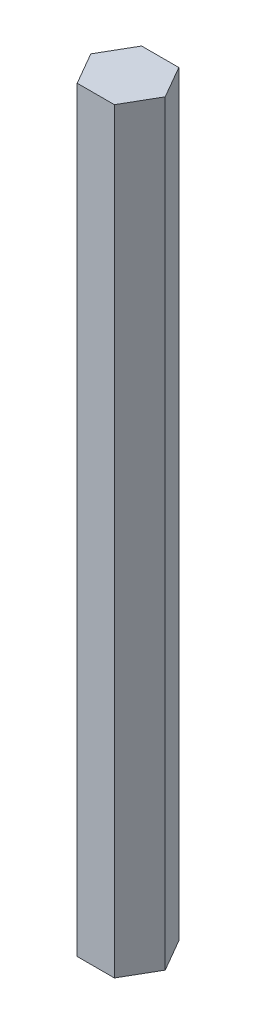
ISO-10303-21;
HEADER;
FILE_DESCRIPTION(('STEP AP214'),'2;1');
FILE_NAME('part.step','',(''),(''),'','','');
FILE_SCHEMA(('AUTOMOTIVE_DESIGN { 1 0 10303 214 1 1 1 1 }'));
ENDSEC;
DATA;
#1=APPLICATION_CONTEXT('core data for automotive mechanical design processes');
#2=APPLICATION_PROTOCOL_DEFINITION('international standard','automotive_design',2000,#1);
#3=PRODUCT_CONTEXT('',#1,'mechanical');
#4=PRODUCT('Part','Part','',(#3));
#5=PRODUCT_RELATED_PRODUCT_CATEGORY('part','',(#4));
#6=PRODUCT_DEFINITION_FORMATION('','',#4);
#7=PRODUCT_DEFINITION_CONTEXT('part definition',#1,'design');
#8=PRODUCT_DEFINITION('design','',#6,#7);
#9=PRODUCT_DEFINITION_SHAPE('','',#8);
#10=(LENGTH_UNIT() NAMED_UNIT(*) SI_UNIT(.MILLI.,.METRE.));
#11=(NAMED_UNIT(*) PLANE_ANGLE_UNIT() SI_UNIT($,.RADIAN.));
#12=(NAMED_UNIT(*) SI_UNIT($,.STERADIAN.) SOLID_ANGLE_UNIT());
#13=UNCERTAINTY_MEASURE_WITH_UNIT(LENGTH_MEASURE(1.E-05),#10,'distance_accuracy_value','');
#14=(GEOMETRIC_REPRESENTATION_CONTEXT(3) GLOBAL_UNCERTAINTY_ASSIGNED_CONTEXT((#13)) GLOBAL_UNIT_ASSIGNED_CONTEXT((#10,
#11,#12)) REPRESENTATION_CONTEXT('',''));
#15=CARTESIAN_POINT('',(0.,0.,0.));
#16=DIRECTION('',(0.,0.,1.));
#17=DIRECTION('',(1.,0.,0.));
#18=AXIS2_PLACEMENT_3D('',#15,#16,#17);
#19=CARTESIAN_POINT('',(1.5,61.,2.59807621135332));
#20=DIRECTION('',(-0.866025403784439,0.,-0.5));
#21=DIRECTION('',(-0.5,0.,0.866025403784439));
#22=AXIS2_PLACEMENT_3D('',#19,#20,#21);
#23=PLANE('',#22);
#24=DIRECTION('',(0.5,0.,-0.866025403784439));
#25=VECTOR('',#24,1.);
#26=CARTESIAN_POINT('',(1.5,0.,2.59807621135332));
#27=LINE('',#26,#25);
#28=CARTESIAN_POINT('',(1.5,0.,2.59807621135332));
#29=VERTEX_POINT('',#28);
#30=CARTESIAN_POINT('',(3.,0.,0.));
#31=VERTEX_POINT('',#30);
#32=EDGE_CURVE('E116',#29,#31,#27,.T.);
#33=ORIENTED_EDGE('',*,*,#32,.T.);
#34=DIRECTION('',(0.,-1.,0.));
#35=VECTOR('',#34,1.);
#36=CARTESIAN_POINT('',(3.,61.,0.));
#37=LINE('',#36,#35);
#38=CARTESIAN_POINT('',(3.,61.,0.));
#39=VERTEX_POINT('',#38);
#40=EDGE_CURVE('E11',#39,#31,#37,.T.);
#41=ORIENTED_EDGE('',*,*,#40,.F.);
#42=DIRECTION('',(0.5,0.,-0.866025403784439));
#43=VECTOR('',#42,1.);
#44=CARTESIAN_POINT('',(1.5,61.,2.59807621135332));
#45=LINE('',#44,#43);
#46=CARTESIAN_POINT('',(1.5,61.,2.59807621135332));
#47=VERTEX_POINT('',#46);
#48=EDGE_CURVE('E127',#47,#39,#45,.T.);
#49=ORIENTED_EDGE('',*,*,#48,.F.);
#50=DIRECTION('',(0.,-1.,0.));
#51=VECTOR('',#50,1.);
#52=CARTESIAN_POINT('',(1.5,61.,2.59807621135332));
#53=LINE('',#52,#51);
#54=EDGE_CURVE('E112',#47,#29,#53,.T.);
#55=ORIENTED_EDGE('',*,*,#54,.T.);
#56=EDGE_LOOP('',(#33,#41,#49,#55));
#57=FACE_BOUND('',#56,.T.);
#58=ADVANCED_FACE('F32',(#57),#23,.F.);
#59=CARTESIAN_POINT('',(3.,61.,0.));
#60=DIRECTION('',(-0.866025403784438,0.,0.5));
#61=DIRECTION('',(0.5,0.,0.866025403784439));
#62=AXIS2_PLACEMENT_3D('',#59,#60,#61);
#63=PLANE('',#62);
#64=DIRECTION('',(-0.5,0.,-0.866025403784439));
#65=VECTOR('',#64,1.);
#66=CARTESIAN_POINT('',(3.,0.,0.));
#67=LINE('',#66,#65);
#68=CARTESIAN_POINT('',(1.5,0.,-2.59807621135332));
#69=VERTEX_POINT('',#68);
#70=EDGE_CURVE('E119',#31,#69,#67,.T.);
#71=ORIENTED_EDGE('',*,*,#70,.T.);
#72=DIRECTION('',(0.,-1.,0.));
#73=VECTOR('',#72,1.);
#74=CARTESIAN_POINT('',(1.5,61.,-2.59807621135332));
#75=LINE('',#74,#73);
#76=CARTESIAN_POINT('',(1.5,61.,-2.59807621135332));
#77=VERTEX_POINT('',#76);
#78=EDGE_CURVE('E40',#77,#69,#75,.T.);
#79=ORIENTED_EDGE('',*,*,#78,.F.);
#80=DIRECTION('',(-0.5,0.,-0.866025403784439));
#81=VECTOR('',#80,1.);
#82=CARTESIAN_POINT('',(3.,61.,0.));
#83=LINE('',#82,#81);
#84=EDGE_CURVE('E85',#39,#77,#83,.T.);
#85=ORIENTED_EDGE('',*,*,#84,.F.);
#86=ORIENTED_EDGE('',*,*,#40,.T.);
#87=EDGE_LOOP('',(#71,#79,#85,#86));
#88=FACE_BOUND('',#87,.T.);
#89=ADVANCED_FACE('F151',(#88),#63,.F.);
#90=CARTESIAN_POINT('',(1.5,61.,-2.59807621135332));
#91=DIRECTION('',(0.,0.,1.));
#92=DIRECTION('',(1.,0.,0.));
#93=AXIS2_PLACEMENT_3D('',#90,#91,#92);
#94=PLANE('',#93);
#95=DIRECTION('',(-1.,0.,0.));
#96=VECTOR('',#95,1.);
#97=CARTESIAN_POINT('',(1.5,0.,-2.59807621135332));
#98=LINE('',#97,#96);
#99=CARTESIAN_POINT('',(-1.5,0.,-2.59807621135332));
#100=VERTEX_POINT('',#99);
#101=EDGE_CURVE('E122',#69,#100,#98,.T.);
#102=ORIENTED_EDGE('',*,*,#101,.T.);
#103=DIRECTION('',(0.,-1.,0.));
#104=VECTOR('',#103,1.);
#105=CARTESIAN_POINT('',(-1.5,61.,-2.59807621135332));
#106=LINE('',#105,#104);
#107=CARTESIAN_POINT('',(-1.5,61.,-2.59807621135332));
#108=VERTEX_POINT('',#107);
#109=EDGE_CURVE('E107',#108,#100,#106,.T.);
#110=ORIENTED_EDGE('',*,*,#109,.F.);
#111=DIRECTION('',(-1.,0.,0.));
#112=VECTOR('',#111,1.);
#113=CARTESIAN_POINT('',(1.5,61.,-2.59807621135332));
#114=LINE('',#113,#112);
#115=EDGE_CURVE('E98',#77,#108,#114,.T.);
#116=ORIENTED_EDGE('',*,*,#115,.F.);
#117=ORIENTED_EDGE('',*,*,#78,.T.);
#118=EDGE_LOOP('',(#102,#110,#116,#117));
#119=FACE_BOUND('',#118,.T.);
#120=ADVANCED_FACE('F133',(#119),#94,.F.);
#121=CARTESIAN_POINT('',(-1.5,61.,-2.59807621135332));
#122=DIRECTION('',(0.866025403784439,0.,0.5));
#123=DIRECTION('',(0.5,0.,-0.866025403784439));
#124=AXIS2_PLACEMENT_3D('',#121,#122,#123);
#125=PLANE('',#124);
#126=DIRECTION('',(-0.5,0.,0.866025403784439));
#127=VECTOR('',#126,1.);
#128=CARTESIAN_POINT('',(-1.5,0.,-2.59807621135332));
#129=LINE('',#128,#127);
#130=CARTESIAN_POINT('',(-3.,0.,0.));
#131=VERTEX_POINT('',#130);
#132=EDGE_CURVE('E106',#100,#131,#129,.T.);
#133=ORIENTED_EDGE('',*,*,#132,.T.);
#134=DIRECTION('',(0.,-1.,0.));
#135=VECTOR('',#134,1.);
#136=CARTESIAN_POINT('',(-3.,61.,0.));
#137=LINE('',#136,#135);
#138=CARTESIAN_POINT('',(-3.,61.,0.));
#139=VERTEX_POINT('',#138);
#140=EDGE_CURVE('E103',#139,#131,#137,.T.);
#141=ORIENTED_EDGE('',*,*,#140,.F.);
#142=DIRECTION('',(-0.5,0.,0.866025403784439));
#143=VECTOR('',#142,1.);
#144=CARTESIAN_POINT('',(-1.5,61.,-2.59807621135332));
#145=LINE('',#144,#143);
#146=EDGE_CURVE('E92',#108,#139,#145,.T.);
#147=ORIENTED_EDGE('',*,*,#146,.F.);
#148=ORIENTED_EDGE('',*,*,#109,.T.);
#149=EDGE_LOOP('',(#133,#141,#147,#148));
#150=FACE_BOUND('',#149,.T.);
#151=ADVANCED_FACE('F104',(#150),#125,.F.);
#152=CARTESIAN_POINT('',(-3.,61.,0.));
#153=DIRECTION('',(0.866025403784438,0.,-0.5));
#154=DIRECTION('',(-0.5,0.,-0.866025403784439));
#155=AXIS2_PLACEMENT_3D('',#152,#153,#154);
#156=PLANE('',#155);
#157=DIRECTION('',(0.5,0.,0.866025403784439));
#158=VECTOR('',#157,1.);
#159=CARTESIAN_POINT('',(-3.,0.,0.));
#160=LINE('',#159,#158);
#161=CARTESIAN_POINT('',(-1.5,0.,2.59807621135332));
#162=VERTEX_POINT('',#161);
#163=EDGE_CURVE('E71',#131,#162,#160,.T.);
#164=ORIENTED_EDGE('',*,*,#163,.T.);
#165=DIRECTION('',(0.,-1.,0.));
#166=VECTOR('',#165,1.);
#167=CARTESIAN_POINT('',(-1.5,61.,2.59807621135332));
#168=LINE('',#167,#166);
#169=CARTESIAN_POINT('',(-1.5,61.,2.59807621135332));
#170=VERTEX_POINT('',#169);
#171=EDGE_CURVE('E108',#170,#162,#168,.T.);
#172=ORIENTED_EDGE('',*,*,#171,.F.);
#173=DIRECTION('',(0.5,0.,0.866025403784439));
#174=VECTOR('',#173,1.);
#175=CARTESIAN_POINT('',(-3.,61.,0.));
#176=LINE('',#175,#174);
#177=EDGE_CURVE('E96',#139,#170,#176,.T.);
#178=ORIENTED_EDGE('',*,*,#177,.F.);
#179=ORIENTED_EDGE('',*,*,#140,.T.);
#180=EDGE_LOOP('',(#164,#172,#178,#179));
#181=FACE_BOUND('',#180,.T.);
#182=ADVANCED_FACE('F110',(#181),#156,.F.);
#183=CARTESIAN_POINT('',(-1.5,61.,2.59807621135332));
#184=DIRECTION('',(0.,0.,-1.));
#185=DIRECTION('',(-1.,0.,0.));
#186=AXIS2_PLACEMENT_3D('',#183,#184,#185);
#187=PLANE('',#186);
#188=DIRECTION('',(1.,0.,0.));
#189=VECTOR('',#188,1.);
#190=CARTESIAN_POINT('',(-1.5,0.,2.59807621135332));
#191=LINE('',#190,#189);
#192=EDGE_CURVE('E77',#162,#29,#191,.T.);
#193=ORIENTED_EDGE('',*,*,#192,.T.);
#194=ORIENTED_EDGE('',*,*,#54,.F.);
#195=DIRECTION('',(1.,0.,0.));
#196=VECTOR('',#195,1.);
#197=CARTESIAN_POINT('',(-1.5,61.,2.59807621135332));
#198=LINE('',#197,#196);
#199=EDGE_CURVE('E48',#170,#47,#198,.T.);
#200=ORIENTED_EDGE('',*,*,#199,.F.);
#201=ORIENTED_EDGE('',*,*,#171,.T.);
#202=EDGE_LOOP('',(#193,#194,#200,#201));
#203=FACE_BOUND('',#202,.T.);
#204=ADVANCED_FACE('F140',(#203),#187,.F.);
#205=CARTESIAN_POINT('',(0.,61.,0.));
#206=DIRECTION('',(0.,1.,0.));
#207=DIRECTION('',(0.,0.,1.));
#208=AXIS2_PLACEMENT_3D('',#205,#206,#207);
#209=PLANE('',#208);
#210=ORIENTED_EDGE('',*,*,#48,.T.);
#211=ORIENTED_EDGE('',*,*,#84,.T.);
#212=ORIENTED_EDGE('',*,*,#115,.T.);
#213=ORIENTED_EDGE('',*,*,#146,.T.);
#214=ORIENTED_EDGE('',*,*,#177,.T.);
#215=ORIENTED_EDGE('',*,*,#199,.T.);
#216=EDGE_LOOP('',(#210,#211,#212,#213,#214,#215));
#217=FACE_BOUND('',#216,.T.);
#218=ADVANCED_FACE('F94',(#217),#209,.T.);
#219=CARTESIAN_POINT('',(0.,0.,0.));
#220=DIRECTION('',(0.,1.,0.));
#221=DIRECTION('',(0.,0.,1.));
#222=AXIS2_PLACEMENT_3D('',#219,#220,#221);
#223=PLANE('',#222);
#224=CARTESIAN_POINT('',(0.,0.,0.));
#225=DIRECTION('',(0.,-1.,0.));
#226=DIRECTION('',(0.,0.,-1.));
#227=AXIS2_PLACEMENT_3D('',#224,#225,#226);
#228=CIRCLE('',#227,1.6);
#229=CARTESIAN_POINT('',(0.,0.,-1.6));
#230=VERTEX_POINT('',#229);
#231=EDGE_CURVE('E213',#230,#230,#228,.T.);
#232=ORIENTED_EDGE('',*,*,#231,.F.);
#233=EDGE_LOOP('',(#232));
#234=FACE_BOUND('',#233,.T.);
#235=ORIENTED_EDGE('',*,*,#32,.F.);
#236=ORIENTED_EDGE('',*,*,#192,.F.);
#237=ORIENTED_EDGE('',*,*,#163,.F.);
#238=ORIENTED_EDGE('',*,*,#132,.F.);
#239=ORIENTED_EDGE('',*,*,#101,.F.);
#240=ORIENTED_EDGE('',*,*,#70,.F.);
#241=EDGE_LOOP('',(#235,#236,#237,#238,#239,#240));
#242=FACE_BOUND('',#241,.T.);
#243=ADVANCED_FACE('F136',(#234,#242),#223,.F.);
#244=CARTESIAN_POINT('',(0.,5.,0.));
#245=DIRECTION('',(0.,-1.,0.));
#246=DIRECTION('',(0.,0.,-1.));
#247=AXIS2_PLACEMENT_3D('',#244,#245,#246);
#248=CYLINDRICAL_SURFACE('',#247,1.6);
#249=CARTESIAN_POINT('',(0.,5.,0.));
#250=DIRECTION('',(0.,-1.,0.));
#251=DIRECTION('',(0.,0.,-1.));
#252=AXIS2_PLACEMENT_3D('',#249,#250,#251);
#253=CIRCLE('',#252,1.6);
#254=CARTESIAN_POINT('',(0.,5.,-1.6));
#255=VERTEX_POINT('',#254);
#256=EDGE_CURVE('E120',#255,#255,#253,.T.);
#257=ORIENTED_EDGE('',*,*,#256,.F.);
#258=EDGE_LOOP('',(#257));
#259=FACE_BOUND('',#258,.T.);
#260=ORIENTED_EDGE('',*,*,#231,.T.);
#261=EDGE_LOOP('',(#260));
#262=FACE_BOUND('',#261,.T.);
#263=ADVANCED_FACE('F188',(#259,#262),#248,.F.);
#264=CARTESIAN_POINT('',(0.,5.,0.));
#265=DIRECTION('',(0.,-1.,0.));
#266=DIRECTION('',(0.,0.,-1.));
#267=AXIS2_PLACEMENT_3D('',#264,#265,#266);
#268=PLANE('',#267);
#269=ORIENTED_EDGE('',*,*,#256,.T.);
#270=EDGE_LOOP('',(#269));
#271=FACE_BOUND('',#270,.T.);
#272=ADVANCED_FACE('F197',(#271),#268,.T.);
#273=CLOSED_SHELL('',(#58,#89,#120,#151,#182,#204,#218,#243,#263,#272));
#274=MANIFOLD_SOLID_BREP('B2',#273);
#275=ADVANCED_BREP_SHAPE_REPRESENTATION('',(#18,#274),#14);
#276=SHAPE_DEFINITION_REPRESENTATION(#9,#275);
ENDSEC;
END-ISO-10303-21;
